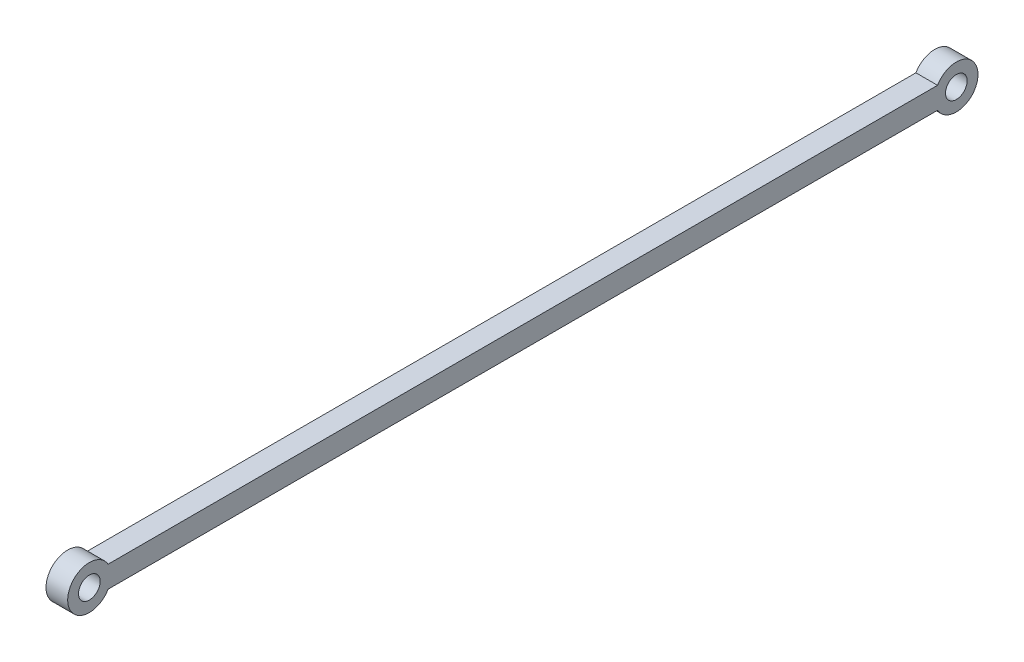
ISO-10303-21;
HEADER;
FILE_DESCRIPTION(('STEP AP214'),'2;1');
FILE_NAME('part.step','',(''),(''),'','','');
FILE_SCHEMA(('AUTOMOTIVE_DESIGN { 1 0 10303 214 1 1 1 1 }'));
ENDSEC;
DATA;
#1=APPLICATION_CONTEXT('core data for automotive mechanical design processes');
#2=APPLICATION_PROTOCOL_DEFINITION('international standard','automotive_design',2000,#1);
#3=PRODUCT_CONTEXT('',#1,'mechanical');
#4=PRODUCT('Part','Part','',(#3));
#5=PRODUCT_RELATED_PRODUCT_CATEGORY('part','',(#4));
#6=PRODUCT_DEFINITION_FORMATION('','',#4);
#7=PRODUCT_DEFINITION_CONTEXT('part definition',#1,'design');
#8=PRODUCT_DEFINITION('design','',#6,#7);
#9=PRODUCT_DEFINITION_SHAPE('','',#8);
#10=(LENGTH_UNIT() NAMED_UNIT(*) SI_UNIT(.MILLI.,.METRE.));
#11=(NAMED_UNIT(*) PLANE_ANGLE_UNIT() SI_UNIT($,.RADIAN.));
#12=(NAMED_UNIT(*) SI_UNIT($,.STERADIAN.) SOLID_ANGLE_UNIT());
#13=UNCERTAINTY_MEASURE_WITH_UNIT(LENGTH_MEASURE(1.E-05),#10,'distance_accuracy_value','');
#14=(GEOMETRIC_REPRESENTATION_CONTEXT(3) GLOBAL_UNCERTAINTY_ASSIGNED_CONTEXT((#13)) GLOBAL_UNIT_ASSIGNED_CONTEXT((#10,
#11,#12)) REPRESENTATION_CONTEXT('',''));
#15=CARTESIAN_POINT('',(0.,0.,0.));
#16=DIRECTION('',(0.,0.,1.));
#17=DIRECTION('',(1.,0.,0.));
#18=AXIS2_PLACEMENT_3D('',#15,#16,#17);
#19=CARTESIAN_POINT('',(2.5,0.,50.));
#20=DIRECTION('',(1.,0.,0.));
#21=DIRECTION('',(0.,0.,-1.));
#22=AXIS2_PLACEMENT_3D('',#19,#20,#21);
#23=PLANE('',#22);
#24=CARTESIAN_POINT('',(2.5,0.,50.));
#25=DIRECTION('',(1.,0.,0.));
#26=DIRECTION('',(0.,0.,-1.));
#27=AXIS2_PLACEMENT_3D('',#24,#25,#26);
#28=CIRCLE('',#27,1.25);
#29=CARTESIAN_POINT('',(2.5,0.,48.75));
#30=VERTEX_POINT('',#29);
#31=EDGE_CURVE('E99',#30,#30,#28,.T.);
#32=ORIENTED_EDGE('',*,*,#31,.F.);
#33=EDGE_LOOP('',(#32));
#34=FACE_BOUND('',#33,.T.);
#35=CARTESIAN_POINT('',(2.5,0.,50.));
#36=DIRECTION('',(1.,0.,0.));
#37=DIRECTION('',(0.,0.,-1.));
#38=AXIS2_PLACEMENT_3D('',#35,#36,#37);
#39=CIRCLE('',#38,2.5);
#40=CARTESIAN_POINT('',(2.5,1.25,47.8349364905389));
#41=VERTEX_POINT('',#40);
#42=CARTESIAN_POINT('',(2.5,-1.25,47.8349364905389));
#43=VERTEX_POINT('',#42);
#44=EDGE_CURVE('E84',#41,#43,#39,.T.);
#45=ORIENTED_EDGE('',*,*,#44,.T.);
#46=DIRECTION('',(0.,0.,-1.));
#47=VECTOR('',#46,1.);
#48=CARTESIAN_POINT('',(2.5,-1.25,47.8349364905389));
#49=LINE('',#48,#47);
#50=CARTESIAN_POINT('',(2.5,-1.25,-47.8349364905389));
#51=VERTEX_POINT('',#50);
#52=EDGE_CURVE('E79',#43,#51,#49,.T.);
#53=ORIENTED_EDGE('',*,*,#52,.T.);
#54=CARTESIAN_POINT('',(2.5,0.,-50.));
#55=DIRECTION('',(1.,0.,0.));
#56=DIRECTION('',(0.,0.,-1.));
#57=AXIS2_PLACEMENT_3D('',#54,#55,#56);
#58=CIRCLE('',#57,2.5);
#59=CARTESIAN_POINT('',(2.5,1.25,-47.8349364905389));
#60=VERTEX_POINT('',#59);
#61=EDGE_CURVE('E82',#51,#60,#58,.T.);
#62=ORIENTED_EDGE('',*,*,#61,.T.);
#63=DIRECTION('',(0.,0.,1.));
#64=VECTOR('',#63,1.);
#65=CARTESIAN_POINT('',(2.5,1.25,47.8349364905389));
#66=LINE('',#65,#64);
#67=EDGE_CURVE('E49',#60,#41,#66,.T.);
#68=ORIENTED_EDGE('',*,*,#67,.T.);
#69=EDGE_LOOP('',(#45,#53,#62,#68));
#70=FACE_BOUND('',#69,.T.);
#71=CARTESIAN_POINT('',(2.5,0.,-50.));
#72=DIRECTION('',(1.,0.,0.));
#73=DIRECTION('',(0.,0.,-1.));
#74=AXIS2_PLACEMENT_3D('',#71,#72,#73);
#75=CIRCLE('',#74,1.25);
#76=CARTESIAN_POINT('',(2.5,0.,-51.25));
#77=VERTEX_POINT('',#76);
#78=EDGE_CURVE('E114',#77,#77,#75,.T.);
#79=ORIENTED_EDGE('',*,*,#78,.F.);
#80=EDGE_LOOP('',(#79));
#81=FACE_BOUND('',#80,.T.);
#82=ADVANCED_FACE('F32',(#34,#70,#81),#23,.T.);
#83=CARTESIAN_POINT('',(0.,0.,50.));
#84=DIRECTION('',(1.,0.,0.));
#85=DIRECTION('',(0.,0.,-1.));
#86=AXIS2_PLACEMENT_3D('',#83,#84,#85);
#87=PLANE('',#86);
#88=CARTESIAN_POINT('',(0.,0.,50.));
#89=DIRECTION('',(1.,0.,0.));
#90=DIRECTION('',(0.,0.,-1.));
#91=AXIS2_PLACEMENT_3D('',#88,#89,#90);
#92=CIRCLE('',#91,2.5);
#93=CARTESIAN_POINT('',(0.,1.25,47.8349364905389));
#94=VERTEX_POINT('',#93);
#95=CARTESIAN_POINT('',(0.,-1.25,47.8349364905389));
#96=VERTEX_POINT('',#95);
#97=EDGE_CURVE('E96',#94,#96,#92,.T.);
#98=ORIENTED_EDGE('',*,*,#97,.F.);
#99=DIRECTION('',(0.,0.,1.));
#100=VECTOR('',#99,1.);
#101=CARTESIAN_POINT('',(0.,1.25,47.8349364905389));
#102=LINE('',#101,#100);
#103=CARTESIAN_POINT('',(0.,1.25,-47.8349364905389));
#104=VERTEX_POINT('',#103);
#105=EDGE_CURVE('E72',#104,#94,#102,.T.);
#106=ORIENTED_EDGE('',*,*,#105,.F.);
#107=CARTESIAN_POINT('',(0.,0.,-50.));
#108=DIRECTION('',(1.,0.,0.));
#109=DIRECTION('',(0.,0.,-1.));
#110=AXIS2_PLACEMENT_3D('',#107,#108,#109);
#111=CIRCLE('',#110,2.5);
#112=CARTESIAN_POINT('',(0.,-1.25,-47.8349364905389));
#113=VERTEX_POINT('',#112);
#114=EDGE_CURVE('E66',#113,#104,#111,.T.);
#115=ORIENTED_EDGE('',*,*,#114,.F.);
#116=DIRECTION('',(0.,0.,-1.));
#117=VECTOR('',#116,1.);
#118=CARTESIAN_POINT('',(0.,-1.25,47.8349364905389));
#119=LINE('',#118,#117);
#120=EDGE_CURVE('E88',#96,#113,#119,.T.);
#121=ORIENTED_EDGE('',*,*,#120,.F.);
#122=EDGE_LOOP('',(#98,#106,#115,#121));
#123=FACE_BOUND('',#122,.T.);
#124=CARTESIAN_POINT('',(0.,0.,50.));
#125=DIRECTION('',(1.,0.,0.));
#126=DIRECTION('',(0.,0.,-1.));
#127=AXIS2_PLACEMENT_3D('',#124,#125,#126);
#128=CIRCLE('',#127,1.25);
#129=CARTESIAN_POINT('',(0.,0.,48.75));
#130=VERTEX_POINT('',#129);
#131=EDGE_CURVE('E111',#130,#130,#128,.T.);
#132=ORIENTED_EDGE('',*,*,#131,.T.);
#133=EDGE_LOOP('',(#132));
#134=FACE_BOUND('',#133,.T.);
#135=CARTESIAN_POINT('',(0.,0.,-50.));
#136=DIRECTION('',(1.,0.,0.));
#137=DIRECTION('',(0.,0.,-1.));
#138=AXIS2_PLACEMENT_3D('',#135,#136,#137);
#139=CIRCLE('',#138,1.25);
#140=CARTESIAN_POINT('',(0.,0.,-51.25));
#141=VERTEX_POINT('',#140);
#142=EDGE_CURVE('E117',#141,#141,#139,.T.);
#143=ORIENTED_EDGE('',*,*,#142,.T.);
#144=EDGE_LOOP('',(#143));
#145=FACE_BOUND('',#144,.T.);
#146=ADVANCED_FACE('F107',(#123,#134,#145),#87,.F.);
#147=CARTESIAN_POINT('',(2.5,0.,50.));
#148=DIRECTION('',(-1.,0.,0.));
#149=DIRECTION('',(0.,0.,1.));
#150=AXIS2_PLACEMENT_3D('',#147,#148,#149);
#151=CYLINDRICAL_SURFACE('',#150,2.5);
#152=ORIENTED_EDGE('',*,*,#97,.T.);
#153=DIRECTION('',(-1.,0.,0.));
#154=VECTOR('',#153,1.);
#155=CARTESIAN_POINT('',(2.5,-1.25,47.8349364905389));
#156=LINE('',#155,#154);
#157=EDGE_CURVE('E11',#43,#96,#156,.T.);
#158=ORIENTED_EDGE('',*,*,#157,.F.);
#159=ORIENTED_EDGE('',*,*,#44,.F.);
#160=DIRECTION('',(-1.,0.,0.));
#161=VECTOR('',#160,1.);
#162=CARTESIAN_POINT('',(2.5,1.25,47.8349364905389));
#163=LINE('',#162,#161);
#164=EDGE_CURVE('E92',#41,#94,#163,.T.);
#165=ORIENTED_EDGE('',*,*,#164,.T.);
#166=EDGE_LOOP('',(#152,#158,#159,#165));
#167=FACE_BOUND('',#166,.T.);
#168=ADVANCED_FACE('F34',(#167),#151,.T.);
#169=CARTESIAN_POINT('',(2.5,-1.25,47.8349364905389));
#170=DIRECTION('',(0.,1.,0.));
#171=DIRECTION('',(0.,0.,1.));
#172=AXIS2_PLACEMENT_3D('',#169,#170,#171);
#173=PLANE('',#172);
#174=ORIENTED_EDGE('',*,*,#120,.T.);
#175=DIRECTION('',(-1.,0.,0.));
#176=VECTOR('',#175,1.);
#177=CARTESIAN_POINT('',(2.5,-1.25,-47.8349364905389));
#178=LINE('',#177,#176);
#179=EDGE_CURVE('E41',#51,#113,#178,.T.);
#180=ORIENTED_EDGE('',*,*,#179,.F.);
#181=ORIENTED_EDGE('',*,*,#52,.F.);
#182=ORIENTED_EDGE('',*,*,#157,.T.);
#183=EDGE_LOOP('',(#174,#180,#181,#182));
#184=FACE_BOUND('',#183,.T.);
#185=ADVANCED_FACE('F87',(#184),#173,.F.);
#186=CARTESIAN_POINT('',(2.5,0.,-50.));
#187=DIRECTION('',(-1.,0.,0.));
#188=DIRECTION('',(0.,0.,1.));
#189=AXIS2_PLACEMENT_3D('',#186,#187,#188);
#190=CYLINDRICAL_SURFACE('',#189,2.5);
#191=ORIENTED_EDGE('',*,*,#114,.T.);
#192=DIRECTION('',(-1.,0.,0.));
#193=VECTOR('',#192,1.);
#194=CARTESIAN_POINT('',(2.5,1.25,-47.8349364905389));
#195=LINE('',#194,#193);
#196=EDGE_CURVE('E89',#60,#104,#195,.T.);
#197=ORIENTED_EDGE('',*,*,#196,.F.);
#198=ORIENTED_EDGE('',*,*,#61,.F.);
#199=ORIENTED_EDGE('',*,*,#179,.T.);
#200=EDGE_LOOP('',(#191,#197,#198,#199));
#201=FACE_BOUND('',#200,.T.);
#202=ADVANCED_FACE('F90',(#201),#190,.T.);
#203=CARTESIAN_POINT('',(2.5,1.25,47.8349364905389));
#204=DIRECTION('',(0.,-1.,0.));
#205=DIRECTION('',(0.,0.,-1.));
#206=AXIS2_PLACEMENT_3D('',#203,#204,#205);
#207=PLANE('',#206);
#208=ORIENTED_EDGE('',*,*,#105,.T.);
#209=ORIENTED_EDGE('',*,*,#164,.F.);
#210=ORIENTED_EDGE('',*,*,#67,.F.);
#211=ORIENTED_EDGE('',*,*,#196,.T.);
#212=EDGE_LOOP('',(#208,#209,#210,#211));
#213=FACE_BOUND('',#212,.T.);
#214=ADVANCED_FACE('F104',(#213),#207,.F.);
#215=CARTESIAN_POINT('',(2.5,0.,50.));
#216=DIRECTION('',(-1.,0.,0.));
#217=DIRECTION('',(0.,0.,1.));
#218=AXIS2_PLACEMENT_3D('',#215,#216,#217);
#219=CYLINDRICAL_SURFACE('',#218,1.25);
#220=ORIENTED_EDGE('',*,*,#31,.T.);
#221=EDGE_LOOP('',(#220));
#222=FACE_BOUND('',#221,.T.);
#223=ORIENTED_EDGE('',*,*,#131,.F.);
#224=EDGE_LOOP('',(#223));
#225=FACE_BOUND('',#224,.T.);
#226=ADVANCED_FACE('F134',(#222,#225),#219,.F.);
#227=CARTESIAN_POINT('',(2.5,0.,-50.));
#228=DIRECTION('',(-1.,0.,0.));
#229=DIRECTION('',(0.,0.,1.));
#230=AXIS2_PLACEMENT_3D('',#227,#228,#229);
#231=CYLINDRICAL_SURFACE('',#230,1.25);
#232=ORIENTED_EDGE('',*,*,#78,.T.);
#233=EDGE_LOOP('',(#232));
#234=FACE_BOUND('',#233,.T.);
#235=ORIENTED_EDGE('',*,*,#142,.F.);
#236=EDGE_LOOP('',(#235));
#237=FACE_BOUND('',#236,.T.);
#238=ADVANCED_FACE('F123',(#234,#237),#231,.F.);
#239=CLOSED_SHELL('',(#82,#146,#168,#185,#202,#214,#226,#238));
#240=MANIFOLD_SOLID_BREP('B2',#239);
#241=ADVANCED_BREP_SHAPE_REPRESENTATION('',(#18,#240),#14);
#242=SHAPE_DEFINITION_REPRESENTATION(#9,#241);
ENDSEC;
END-ISO-10303-21;
